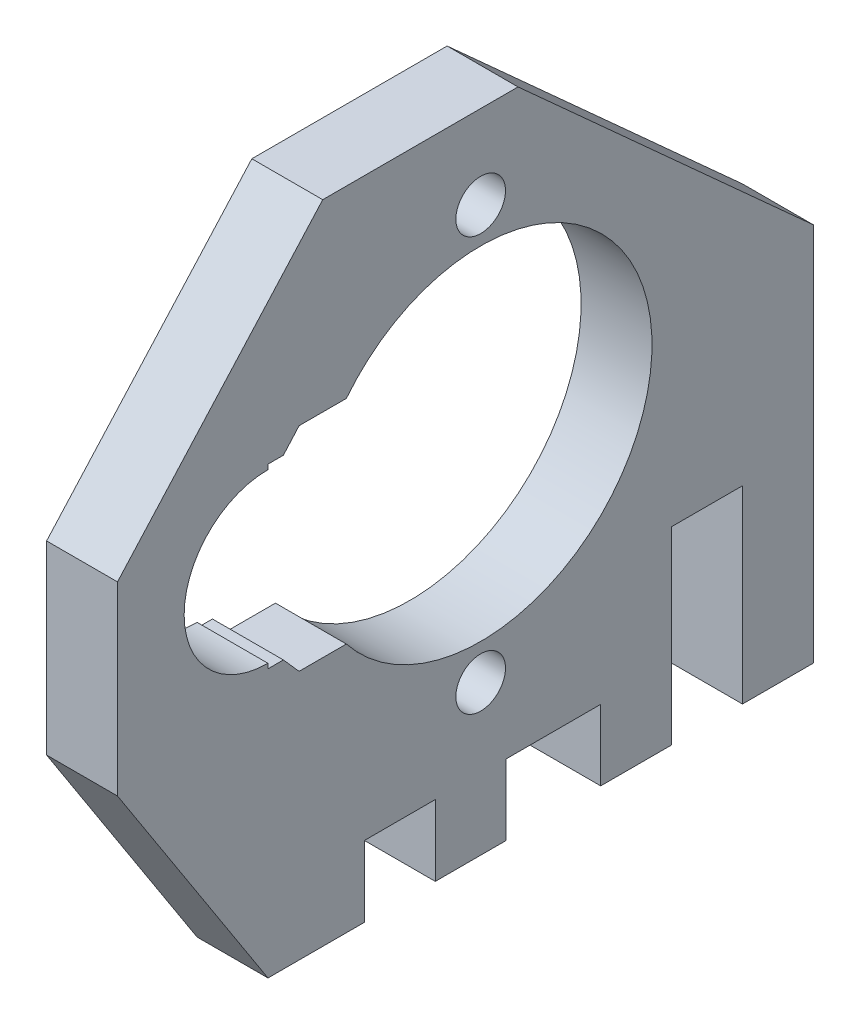
ISO-10303-21;
HEADER;
FILE_DESCRIPTION(('STEP AP214'),'2;1');
FILE_NAME('part.step','',(''),(''),'','','');
FILE_SCHEMA(('AUTOMOTIVE_DESIGN { 1 0 10303 214 1 1 1 1 }'));
ENDSEC;
DATA;
#1=APPLICATION_CONTEXT('core data for automotive mechanical design processes');
#2=APPLICATION_PROTOCOL_DEFINITION('international standard','automotive_design',2000,#1);
#3=PRODUCT_CONTEXT('',#1,'mechanical');
#4=PRODUCT('Part','Part','',(#3));
#5=PRODUCT_RELATED_PRODUCT_CATEGORY('part','',(#4));
#6=PRODUCT_DEFINITION_FORMATION('','',#4);
#7=PRODUCT_DEFINITION_CONTEXT('part definition',#1,'design');
#8=PRODUCT_DEFINITION('design','',#6,#7);
#9=PRODUCT_DEFINITION_SHAPE('','',#8);
#10=(LENGTH_UNIT() NAMED_UNIT(*) SI_UNIT(.MILLI.,.METRE.));
#11=(NAMED_UNIT(*) PLANE_ANGLE_UNIT() SI_UNIT($,.RADIAN.));
#12=(NAMED_UNIT(*) SI_UNIT($,.STERADIAN.) SOLID_ANGLE_UNIT());
#13=UNCERTAINTY_MEASURE_WITH_UNIT(LENGTH_MEASURE(1.E-05),#10,'distance_accuracy_value','');
#14=(GEOMETRIC_REPRESENTATION_CONTEXT(3) GLOBAL_UNCERTAINTY_ASSIGNED_CONTEXT((#13)) GLOBAL_UNIT_ASSIGNED_CONTEXT((#10,
#11,#12)) REPRESENTATION_CONTEXT('',''));
#15=CARTESIAN_POINT('',(0.,0.,0.));
#16=DIRECTION('',(0.,0.,1.));
#17=DIRECTION('',(1.,0.,0.));
#18=AXIS2_PLACEMENT_3D('',#15,#16,#17);
#19=CARTESIAN_POINT('',(6.,0.,10.880328258721));
#20=DIRECTION('',(0.,0.,1.));
#21=DIRECTION('',(1.,0.,0.));
#22=AXIS2_PLACEMENT_3D('',#19,#20,#21);
#23=PLANE('',#22);
#24=DIRECTION('',(0.,1.,0.));
#25=VECTOR('',#24,1.);
#26=CARTESIAN_POINT('',(0.,0.,10.880328258721));
#27=LINE('',#26,#25);
#28=CARTESIAN_POINT('',(0.,-3.40046791418709,10.880328258721));
#29=VERTEX_POINT('',#28);
#30=CARTESIAN_POINT('',(0.,12.2943697080103,10.880328258721));
#31=VERTEX_POINT('',#30);
#32=EDGE_CURVE('E295',#29,#31,#27,.T.);
#33=ORIENTED_EDGE('',*,*,#32,.F.);
#34=DIRECTION('',(-1.,0.,0.));
#35=VECTOR('',#34,1.);
#36=CARTESIAN_POINT('',(6.,-3.40046791418709,10.880328258721));
#37=LINE('',#36,#35);
#38=CARTESIAN_POINT('',(6.,-3.40046791418709,10.880328258721));
#39=VERTEX_POINT('',#38);
#40=EDGE_CURVE('E11',#39,#29,#37,.T.);
#41=ORIENTED_EDGE('',*,*,#40,.F.);
#42=DIRECTION('',(0.,1.,0.));
#43=VECTOR('',#42,1.);
#44=CARTESIAN_POINT('',(6.,0.,10.880328258721));
#45=LINE('',#44,#43);
#46=CARTESIAN_POINT('',(6.,12.2943697080103,10.880328258721));
#47=VERTEX_POINT('',#46);
#48=EDGE_CURVE('E449',#39,#47,#45,.T.);
#49=ORIENTED_EDGE('',*,*,#48,.T.);
#50=DIRECTION('',(-1.,0.,0.));
#51=VECTOR('',#50,1.);
#52=CARTESIAN_POINT('',(6.,12.2943697080103,10.880328258721));
#53=LINE('',#52,#51);
#54=EDGE_CURVE('E54',#47,#31,#53,.T.);
#55=ORIENTED_EDGE('',*,*,#54,.T.);
#56=EDGE_LOOP('',(#33,#41,#49,#55));
#57=FACE_BOUND('',#56,.T.);
#58=ADVANCED_FACE('F35',(#57),#23,.T.);
#59=CARTESIAN_POINT('',(6.,-5.96182546941162,9.22500481892369));
#60=DIRECTION('',(0.,0.542783023363662,-0.839872960362579));
#61=DIRECTION('',(0.,0.839872960362579,0.542783023363662));
#62=AXIS2_PLACEMENT_3D('',#59,#60,#61);
#63=PLANE('',#62);
#64=DIRECTION('',(0.,-0.839872960362579,-0.542783023363662));
#65=VECTOR('',#64,1.);
#66=CARTESIAN_POINT('',(0.,-5.96182546941162,9.22500481892369));
#67=LINE('',#66,#65);
#68=CARTESIAN_POINT('',(0.,-23.1081672603077,-1.8561273));
#69=VERTEX_POINT('',#68);
#70=EDGE_CURVE('E297',#29,#69,#67,.T.);
#71=ORIENTED_EDGE('',*,*,#70,.T.);
#72=DIRECTION('',(-1.,0.,0.));
#73=VECTOR('',#72,1.);
#74=CARTESIAN_POINT('',(6.,-23.1081672603077,-1.8561273));
#75=LINE('',#74,#73);
#76=CARTESIAN_POINT('',(6.,-23.1081672603077,-1.8561273));
#77=VERTEX_POINT('',#76);
#78=EDGE_CURVE('E45',#77,#69,#75,.T.);
#79=ORIENTED_EDGE('',*,*,#78,.F.);
#80=DIRECTION('',(0.,-0.839872960362579,-0.542783023363662));
#81=VECTOR('',#80,1.);
#82=CARTESIAN_POINT('',(6.,-5.96182546941162,9.22500481892369));
#83=LINE('',#82,#81);
#84=EDGE_CURVE('E451',#39,#77,#83,.T.);
#85=ORIENTED_EDGE('',*,*,#84,.F.);
#86=ORIENTED_EDGE('',*,*,#40,.T.);
#87=EDGE_LOOP('',(#71,#79,#85,#86));
#88=FACE_BOUND('',#87,.T.);
#89=ADVANCED_FACE('F511',(#88),#63,.F.);
#90=CARTESIAN_POINT('',(6.,-23.1081672603077,0.));
#91=DIRECTION('',(0.,-1.,0.));
#92=DIRECTION('',(0.,0.,-1.));
#93=AXIS2_PLACEMENT_3D('',#90,#91,#92);
#94=PLANE('',#93);
#95=DIRECTION('',(0.,0.,1.));
#96=VECTOR('',#95,1.);
#97=CARTESIAN_POINT('',(0.,-23.1081672603077,0.));
#98=LINE('',#97,#96);
#99=CARTESIAN_POINT('',(0.,-23.1081672603077,-10.0143952873965));
#100=VERTEX_POINT('',#99);
#101=EDGE_CURVE('E300',#100,#69,#98,.T.);
#102=ORIENTED_EDGE('',*,*,#101,.F.);
#103=DIRECTION('',(-1.,0.,0.));
#104=VECTOR('',#103,1.);
#105=CARTESIAN_POINT('',(6.,-23.1081672603077,-10.0143952873965));
#106=LINE('',#105,#104);
#107=CARTESIAN_POINT('',(6.,-23.1081672603077,-10.0143952873965));
#108=VERTEX_POINT('',#107);
#109=EDGE_CURVE('E378',#108,#100,#106,.T.);
#110=ORIENTED_EDGE('',*,*,#109,.F.);
#111=DIRECTION('',(0.,0.,1.));
#112=VECTOR('',#111,1.);
#113=CARTESIAN_POINT('',(6.,-23.1081672603077,0.));
#114=LINE('',#113,#112);
#115=EDGE_CURVE('E453',#108,#77,#114,.T.);
#116=ORIENTED_EDGE('',*,*,#115,.T.);
#117=ORIENTED_EDGE('',*,*,#78,.T.);
#118=EDGE_LOOP('',(#102,#110,#116,#117));
#119=FACE_BOUND('',#118,.T.);
#120=ADVANCED_FACE('F516',(#119),#94,.T.);
#121=CARTESIAN_POINT('',(6.,0.,-10.0143952873965));
#122=DIRECTION('',(0.,0.,-1.));
#123=DIRECTION('',(-1.,0.,0.));
#124=AXIS2_PLACEMENT_3D('',#121,#122,#123);
#125=PLANE('',#124);
#126=DIRECTION('',(0.,-1.,0.));
#127=VECTOR('',#126,1.);
#128=CARTESIAN_POINT('',(0.,0.,-10.0143952873965));
#129=LINE('',#128,#127);
#130=CARTESIAN_POINT('',(0.,-17.1081672603077,-10.0143952873965));
#131=VERTEX_POINT('',#130);
#132=EDGE_CURVE('E303',#131,#100,#129,.T.);
#133=ORIENTED_EDGE('',*,*,#132,.F.);
#134=DIRECTION('',(-1.,0.,0.));
#135=VECTOR('',#134,1.);
#136=CARTESIAN_POINT('',(6.,-17.1081672603077,-10.0143952873965));
#137=LINE('',#136,#135);
#138=CARTESIAN_POINT('',(6.,-17.1081672603077,-10.0143952873965));
#139=VERTEX_POINT('',#138);
#140=EDGE_CURVE('E376',#139,#131,#137,.T.);
#141=ORIENTED_EDGE('',*,*,#140,.F.);
#142=DIRECTION('',(0.,-1.,0.));
#143=VECTOR('',#142,1.);
#144=CARTESIAN_POINT('',(6.,0.,-10.0143952873965));
#145=LINE('',#144,#143);
#146=EDGE_CURVE('E456',#139,#108,#145,.T.);
#147=ORIENTED_EDGE('',*,*,#146,.T.);
#148=ORIENTED_EDGE('',*,*,#109,.T.);
#149=EDGE_LOOP('',(#133,#141,#147,#148));
#150=FACE_BOUND('',#149,.T.);
#151=ADVANCED_FACE('F608',(#150),#125,.T.);
#152=CARTESIAN_POINT('',(6.,-17.1081672603077,0.));
#153=DIRECTION('',(0.,-1.,0.));
#154=DIRECTION('',(0.,0.,-1.));
#155=AXIS2_PLACEMENT_3D('',#152,#153,#154);
#156=PLANE('',#155);
#157=DIRECTION('',(0.,0.,1.));
#158=VECTOR('',#157,1.);
#159=CARTESIAN_POINT('',(0.,-17.1081672603077,0.));
#160=LINE('',#159,#158);
#161=CARTESIAN_POINT('',(0.,-17.1081672603077,-16.0143952873965));
#162=VERTEX_POINT('',#161);
#163=EDGE_CURVE('E306',#162,#131,#160,.T.);
#164=ORIENTED_EDGE('',*,*,#163,.F.);
#165=DIRECTION('',(-1.,0.,0.));
#166=VECTOR('',#165,1.);
#167=CARTESIAN_POINT('',(6.,-17.1081672603077,-16.0143952873965));
#168=LINE('',#167,#166);
#169=CARTESIAN_POINT('',(6.,-17.1081672603077,-16.0143952873965));
#170=VERTEX_POINT('',#169);
#171=EDGE_CURVE('E374',#170,#162,#168,.T.);
#172=ORIENTED_EDGE('',*,*,#171,.F.);
#173=DIRECTION('',(0.,0.,1.));
#174=VECTOR('',#173,1.);
#175=CARTESIAN_POINT('',(6.,-17.1081672603077,0.));
#176=LINE('',#175,#174);
#177=EDGE_CURVE('E459',#170,#139,#176,.T.);
#178=ORIENTED_EDGE('',*,*,#177,.T.);
#179=ORIENTED_EDGE('',*,*,#140,.T.);
#180=EDGE_LOOP('',(#164,#172,#178,#179));
#181=FACE_BOUND('',#180,.T.);
#182=ADVANCED_FACE('F604',(#181),#156,.T.);
#183=CARTESIAN_POINT('',(6.,0.,-16.0143952873965));
#184=DIRECTION('',(0.,0.,1.));
#185=DIRECTION('',(1.,0.,0.));
#186=AXIS2_PLACEMENT_3D('',#183,#184,#185);
#187=PLANE('',#186);
#188=DIRECTION('',(0.,1.,0.));
#189=VECTOR('',#188,1.);
#190=CARTESIAN_POINT('',(0.,0.,-16.0143952873965));
#191=LINE('',#190,#189);
#192=CARTESIAN_POINT('',(0.,-23.1081672603077,-16.0143952873965));
#193=VERTEX_POINT('',#192);
#194=EDGE_CURVE('E309',#193,#162,#191,.T.);
#195=ORIENTED_EDGE('',*,*,#194,.F.);
#196=DIRECTION('',(-1.,0.,0.));
#197=VECTOR('',#196,1.);
#198=CARTESIAN_POINT('',(6.,-23.1081672603077,-16.0143952873965));
#199=LINE('',#198,#197);
#200=CARTESIAN_POINT('',(6.,-23.1081672603077,-16.0143952873965));
#201=VERTEX_POINT('',#200);
#202=EDGE_CURVE('E372',#201,#193,#199,.T.);
#203=ORIENTED_EDGE('',*,*,#202,.F.);
#204=DIRECTION('',(0.,1.,0.));
#205=VECTOR('',#204,1.);
#206=CARTESIAN_POINT('',(6.,0.,-16.0143952873965));
#207=LINE('',#206,#205);
#208=EDGE_CURVE('E462',#201,#170,#207,.T.);
#209=ORIENTED_EDGE('',*,*,#208,.T.);
#210=ORIENTED_EDGE('',*,*,#171,.T.);
#211=EDGE_LOOP('',(#195,#203,#209,#210));
#212=FACE_BOUND('',#211,.T.);
#213=ADVANCED_FACE('F600',(#212),#187,.T.);
#214=CARTESIAN_POINT('',(6.,-23.1081672603077,0.));
#215=DIRECTION('',(0.,-1.,0.));
#216=DIRECTION('',(0.,0.,-1.));
#217=AXIS2_PLACEMENT_3D('',#214,#215,#216);
#218=PLANE('',#217);
#219=DIRECTION('',(0.,0.,1.));
#220=VECTOR('',#219,1.);
#221=CARTESIAN_POINT('',(0.,-23.1081672603077,0.));
#222=LINE('',#221,#220);
#223=CARTESIAN_POINT('',(0.,-23.1081672603077,-22.0143952873965));
#224=VERTEX_POINT('',#223);
#225=EDGE_CURVE('E312',#224,#193,#222,.T.);
#226=ORIENTED_EDGE('',*,*,#225,.F.);
#227=DIRECTION('',(-1.,0.,0.));
#228=VECTOR('',#227,1.);
#229=CARTESIAN_POINT('',(6.,-23.1081672603077,-22.0143952873965));
#230=LINE('',#229,#228);
#231=CARTESIAN_POINT('',(6.,-23.1081672603077,-22.0143952873965));
#232=VERTEX_POINT('',#231);
#233=EDGE_CURVE('E370',#232,#224,#230,.T.);
#234=ORIENTED_EDGE('',*,*,#233,.F.);
#235=DIRECTION('',(0.,0.,1.));
#236=VECTOR('',#235,1.);
#237=CARTESIAN_POINT('',(6.,-23.1081672603077,0.));
#238=LINE('',#237,#236);
#239=EDGE_CURVE('E465',#232,#201,#238,.T.);
#240=ORIENTED_EDGE('',*,*,#239,.T.);
#241=ORIENTED_EDGE('',*,*,#202,.T.);
#242=EDGE_LOOP('',(#226,#234,#240,#241));
#243=FACE_BOUND('',#242,.T.);
#244=ADVANCED_FACE('F596',(#243),#218,.T.);
#245=CARTESIAN_POINT('',(6.,0.,-22.0143952873965));
#246=DIRECTION('',(0.,0.,-1.));
#247=DIRECTION('',(-1.,0.,0.));
#248=AXIS2_PLACEMENT_3D('',#245,#246,#247);
#249=PLANE('',#248);
#250=DIRECTION('',(0.,-1.,0.));
#251=VECTOR('',#250,1.);
#252=CARTESIAN_POINT('',(0.,0.,-22.0143952873965));
#253=LINE('',#252,#251);
#254=CARTESIAN_POINT('',(0.,-17.1284099513648,-22.0143952873965));
#255=VERTEX_POINT('',#254);
#256=EDGE_CURVE('E315',#255,#224,#253,.T.);
#257=ORIENTED_EDGE('',*,*,#256,.F.);
#258=DIRECTION('',(-1.,0.,0.));
#259=VECTOR('',#258,1.);
#260=CARTESIAN_POINT('',(6.,-17.1284099513648,-22.0143952873965));
#261=LINE('',#260,#259);
#262=CARTESIAN_POINT('',(6.,-17.1284099513648,-22.0143952873965));
#263=VERTEX_POINT('',#262);
#264=EDGE_CURVE('E368',#263,#255,#261,.T.);
#265=ORIENTED_EDGE('',*,*,#264,.F.);
#266=DIRECTION('',(0.,-1.,0.));
#267=VECTOR('',#266,1.);
#268=CARTESIAN_POINT('',(6.,0.,-22.0143952873965));
#269=LINE('',#268,#267);
#270=EDGE_CURVE('E468',#263,#232,#269,.T.);
#271=ORIENTED_EDGE('',*,*,#270,.T.);
#272=ORIENTED_EDGE('',*,*,#233,.T.);
#273=EDGE_LOOP('',(#257,#265,#271,#272));
#274=FACE_BOUND('',#273,.T.);
#275=ADVANCED_FACE('F592',(#274),#249,.T.);
#276=CARTESIAN_POINT('',(6.,-17.1284099513648,0.));
#277=DIRECTION('',(0.,-1.,0.));
#278=DIRECTION('',(0.,0.,-1.));
#279=AXIS2_PLACEMENT_3D('',#276,#277,#278);
#280=PLANE('',#279);
#281=DIRECTION('',(0.,0.,1.));
#282=VECTOR('',#281,1.);
#283=CARTESIAN_POINT('',(0.,-17.1284099513648,0.));
#284=LINE('',#283,#282);
#285=CARTESIAN_POINT('',(0.,-17.1284099513648,-30.0143952873965));
#286=VERTEX_POINT('',#285);
#287=EDGE_CURVE('E318',#286,#255,#284,.T.);
#288=ORIENTED_EDGE('',*,*,#287,.F.);
#289=DIRECTION('',(-1.,0.,0.));
#290=VECTOR('',#289,1.);
#291=CARTESIAN_POINT('',(6.,-17.1284099513648,-30.0143952873965));
#292=LINE('',#291,#290);
#293=CARTESIAN_POINT('',(6.,-17.1284099513648,-30.0143952873965));
#294=VERTEX_POINT('',#293);
#295=EDGE_CURVE('E366',#294,#286,#292,.T.);
#296=ORIENTED_EDGE('',*,*,#295,.F.);
#297=DIRECTION('',(0.,0.,1.));
#298=VECTOR('',#297,1.);
#299=CARTESIAN_POINT('',(6.,-17.1284099513648,0.));
#300=LINE('',#299,#298);
#301=EDGE_CURVE('E471',#294,#263,#300,.T.);
#302=ORIENTED_EDGE('',*,*,#301,.T.);
#303=ORIENTED_EDGE('',*,*,#264,.T.);
#304=EDGE_LOOP('',(#288,#296,#302,#303));
#305=FACE_BOUND('',#304,.T.);
#306=ADVANCED_FACE('F588',(#305),#280,.T.);
#307=CARTESIAN_POINT('',(6.,0.,-30.0143952873965));
#308=DIRECTION('',(0.,0.,1.));
#309=DIRECTION('',(1.,0.,0.));
#310=AXIS2_PLACEMENT_3D('',#307,#308,#309);
#311=PLANE('',#310);
#312=DIRECTION('',(0.,1.,0.));
#313=VECTOR('',#312,1.);
#314=CARTESIAN_POINT('',(0.,0.,-30.0143952873965));
#315=LINE('',#314,#313);
#316=CARTESIAN_POINT('',(0.,-23.1081672603077,-30.0143952873965));
#317=VERTEX_POINT('',#316);
#318=EDGE_CURVE('E321',#317,#286,#315,.T.);
#319=ORIENTED_EDGE('',*,*,#318,.F.);
#320=DIRECTION('',(-1.,0.,0.));
#321=VECTOR('',#320,1.);
#322=CARTESIAN_POINT('',(6.,-23.1081672603077,-30.0143952873965));
#323=LINE('',#322,#321);
#324=CARTESIAN_POINT('',(6.,-23.1081672603077,-30.0143952873965));
#325=VERTEX_POINT('',#324);
#326=EDGE_CURVE('E364',#325,#317,#323,.T.);
#327=ORIENTED_EDGE('',*,*,#326,.F.);
#328=DIRECTION('',(0.,1.,0.));
#329=VECTOR('',#328,1.);
#330=CARTESIAN_POINT('',(6.,0.,-30.0143952873965));
#331=LINE('',#330,#329);
#332=EDGE_CURVE('E474',#325,#294,#331,.T.);
#333=ORIENTED_EDGE('',*,*,#332,.T.);
#334=ORIENTED_EDGE('',*,*,#295,.T.);
#335=EDGE_LOOP('',(#319,#327,#333,#334));
#336=FACE_BOUND('',#335,.T.);
#337=ADVANCED_FACE('F584',(#336),#311,.T.);
#338=CARTESIAN_POINT('',(6.,-23.1081672603077,0.));
#339=DIRECTION('',(0.,-1.,0.));
#340=DIRECTION('',(0.,0.,-1.));
#341=AXIS2_PLACEMENT_3D('',#338,#339,#340);
#342=PLANE('',#341);
#343=DIRECTION('',(0.,0.,1.));
#344=VECTOR('',#343,1.);
#345=CARTESIAN_POINT('',(0.,-23.1081672603077,0.));
#346=LINE('',#345,#344);
#347=CARTESIAN_POINT('',(0.,-23.1081672603077,-36.0143952873965));
#348=VERTEX_POINT('',#347);
#349=EDGE_CURVE('E324',#348,#317,#346,.T.);
#350=ORIENTED_EDGE('',*,*,#349,.F.);
#351=DIRECTION('',(-1.,0.,0.));
#352=VECTOR('',#351,1.);
#353=CARTESIAN_POINT('',(6.,-23.1081672603077,-36.0143952873965));
#354=LINE('',#353,#352);
#355=CARTESIAN_POINT('',(6.,-23.1081672603077,-36.0143952873965));
#356=VERTEX_POINT('',#355);
#357=EDGE_CURVE('E362',#356,#348,#354,.T.);
#358=ORIENTED_EDGE('',*,*,#357,.F.);
#359=DIRECTION('',(0.,0.,1.));
#360=VECTOR('',#359,1.);
#361=CARTESIAN_POINT('',(6.,-23.1081672603077,0.));
#362=LINE('',#361,#360);
#363=EDGE_CURVE('E477',#356,#325,#362,.T.);
#364=ORIENTED_EDGE('',*,*,#363,.T.);
#365=ORIENTED_EDGE('',*,*,#326,.T.);
#366=EDGE_LOOP('',(#350,#358,#364,#365));
#367=FACE_BOUND('',#366,.T.);
#368=ADVANCED_FACE('F580',(#367),#342,.T.);
#369=CARTESIAN_POINT('',(6.,0.,-36.0143952873965));
#370=DIRECTION('',(0.,0.,1.));
#371=DIRECTION('',(1.,0.,0.));
#372=AXIS2_PLACEMENT_3D('',#369,#370,#371);
#373=PLANE('',#372);
#374=DIRECTION('',(0.,1.,0.));
#375=VECTOR('',#374,1.);
#376=CARTESIAN_POINT('',(0.,0.,-36.0143952873965));
#377=LINE('',#376,#375);
#378=CARTESIAN_POINT('',(0.,-7.10816726030771,-36.0143952873965));
#379=VERTEX_POINT('',#378);
#380=EDGE_CURVE('E327',#348,#379,#377,.T.);
#381=ORIENTED_EDGE('',*,*,#380,.T.);
#382=DIRECTION('',(-1.,0.,0.));
#383=VECTOR('',#382,1.);
#384=CARTESIAN_POINT('',(6.,-7.10816726030771,-36.0143952873965));
#385=LINE('',#384,#383);
#386=CARTESIAN_POINT('',(6.,-7.10816726030771,-36.0143952873965));
#387=VERTEX_POINT('',#386);
#388=EDGE_CURVE('E359',#387,#379,#385,.T.);
#389=ORIENTED_EDGE('',*,*,#388,.F.);
#390=DIRECTION('',(0.,1.,0.));
#391=VECTOR('',#390,1.);
#392=CARTESIAN_POINT('',(6.,0.,-36.0143952873965));
#393=LINE('',#392,#391);
#394=EDGE_CURVE('E480',#356,#387,#393,.T.);
#395=ORIENTED_EDGE('',*,*,#394,.F.);
#396=ORIENTED_EDGE('',*,*,#357,.T.);
#397=EDGE_LOOP('',(#381,#389,#395,#396));
#398=FACE_BOUND('',#397,.T.);
#399=ADVANCED_FACE('F576',(#398),#373,.F.);
#400=CARTESIAN_POINT('',(6.,-7.10816726030771,0.));
#401=DIRECTION('',(0.,1.,0.));
#402=DIRECTION('',(0.,0.,1.));
#403=AXIS2_PLACEMENT_3D('',#400,#401,#402);
#404=PLANE('',#403);
#405=DIRECTION('',(0.,0.,-1.));
#406=VECTOR('',#405,1.);
#407=CARTESIAN_POINT('',(0.,-7.10816726030771,0.));
#408=LINE('',#407,#406);
#409=CARTESIAN_POINT('',(0.,-7.10816726030771,-42.0143952873964));
#410=VERTEX_POINT('',#409);
#411=EDGE_CURVE('E330',#379,#410,#408,.T.);
#412=ORIENTED_EDGE('',*,*,#411,.T.);
#413=DIRECTION('',(-1.,0.,0.));
#414=VECTOR('',#413,1.);
#415=CARTESIAN_POINT('',(6.,-7.10816726030771,-42.0143952873964));
#416=LINE('',#415,#414);
#417=CARTESIAN_POINT('',(6.,-7.10816726030771,-42.0143952873964));
#418=VERTEX_POINT('',#417);
#419=EDGE_CURVE('E356',#418,#410,#416,.T.);
#420=ORIENTED_EDGE('',*,*,#419,.F.);
#421=DIRECTION('',(0.,0.,-1.));
#422=VECTOR('',#421,1.);
#423=CARTESIAN_POINT('',(6.,-7.10816726030771,0.));
#424=LINE('',#423,#422);
#425=EDGE_CURVE('E483',#387,#418,#424,.T.);
#426=ORIENTED_EDGE('',*,*,#425,.F.);
#427=ORIENTED_EDGE('',*,*,#388,.T.);
#428=EDGE_LOOP('',(#412,#420,#426,#427));
#429=FACE_BOUND('',#428,.T.);
#430=ADVANCED_FACE('F572',(#429),#404,.F.);
#431=CARTESIAN_POINT('',(6.,0.,-42.0143952873964));
#432=DIRECTION('',(0.,0.,-1.));
#433=DIRECTION('',(-1.,0.,0.));
#434=AXIS2_PLACEMENT_3D('',#431,#432,#433);
#435=PLANE('',#434);
#436=DIRECTION('',(0.,-1.,0.));
#437=VECTOR('',#436,1.);
#438=CARTESIAN_POINT('',(0.,0.,-42.0143952873964));
#439=LINE('',#438,#437);
#440=CARTESIAN_POINT('',(0.,-23.1081672603077,-42.0143952873964));
#441=VERTEX_POINT('',#440);
#442=EDGE_CURVE('E333',#410,#441,#439,.T.);
#443=ORIENTED_EDGE('',*,*,#442,.T.);
#444=DIRECTION('',(-1.,0.,0.));
#445=VECTOR('',#444,1.);
#446=CARTESIAN_POINT('',(6.,-23.1081672603077,-42.0143952873964));
#447=LINE('',#446,#445);
#448=CARTESIAN_POINT('',(6.,-23.1081672603077,-42.0143952873964));
#449=VERTEX_POINT('',#448);
#450=EDGE_CURVE('E354',#449,#441,#447,.T.);
#451=ORIENTED_EDGE('',*,*,#450,.F.);
#452=DIRECTION('',(0.,-1.,0.));
#453=VECTOR('',#452,1.);
#454=CARTESIAN_POINT('',(6.,0.,-42.0143952873964));
#455=LINE('',#454,#453);
#456=EDGE_CURVE('E486',#418,#449,#455,.T.);
#457=ORIENTED_EDGE('',*,*,#456,.F.);
#458=ORIENTED_EDGE('',*,*,#419,.T.);
#459=EDGE_LOOP('',(#443,#451,#457,#458));
#460=FACE_BOUND('',#459,.T.);
#461=ADVANCED_FACE('F568',(#460),#435,.F.);
#462=CARTESIAN_POINT('',(6.,-23.1081672603077,0.));
#463=DIRECTION('',(0.,-1.,0.));
#464=DIRECTION('',(0.,0.,-1.));
#465=AXIS2_PLACEMENT_3D('',#462,#463,#464);
#466=PLANE('',#465);
#467=DIRECTION('',(0.,0.,1.));
#468=VECTOR('',#467,1.);
#469=CARTESIAN_POINT('',(0.,-23.1081672603077,0.));
#470=LINE('',#469,#468);
#471=CARTESIAN_POINT('',(0.,-23.1081672603077,-48.0143952873964));
#472=VERTEX_POINT('',#471);
#473=EDGE_CURVE('E336',#472,#441,#470,.T.);
#474=ORIENTED_EDGE('',*,*,#473,.F.);
#475=DIRECTION('',(-1.,0.,0.));
#476=VECTOR('',#475,1.);
#477=CARTESIAN_POINT('',(6.,-23.1081672603077,-48.0143952873964));
#478=LINE('',#477,#476);
#479=CARTESIAN_POINT('',(6.,-23.1081672603077,-48.0143952873964));
#480=VERTEX_POINT('',#479);
#481=EDGE_CURVE('E352',#480,#472,#478,.T.);
#482=ORIENTED_EDGE('',*,*,#481,.F.);
#483=DIRECTION('',(0.,0.,1.));
#484=VECTOR('',#483,1.);
#485=CARTESIAN_POINT('',(6.,-23.1081672603077,0.));
#486=LINE('',#485,#484);
#487=EDGE_CURVE('E488',#480,#449,#486,.T.);
#488=ORIENTED_EDGE('',*,*,#487,.T.);
#489=ORIENTED_EDGE('',*,*,#450,.T.);
#490=EDGE_LOOP('',(#474,#482,#488,#489));
#491=FACE_BOUND('',#490,.T.);
#492=ADVANCED_FACE('F565',(#491),#466,.T.);
#493=CARTESIAN_POINT('',(6.,0.,-48.0143952873964));
#494=DIRECTION('',(0.,0.,-1.));
#495=DIRECTION('',(-1.,0.,0.));
#496=AXIS2_PLACEMENT_3D('',#493,#494,#495);
#497=PLANE('',#496);
#498=DIRECTION('',(0.,-1.,0.));
#499=VECTOR('',#498,1.);
#500=CARTESIAN_POINT('',(0.,0.,-48.0143952873964));
#501=LINE('',#500,#499);
#502=CARTESIAN_POINT('',(0.,9.01762803628445,-48.0143952873965));
#503=VERTEX_POINT('',#502);
#504=EDGE_CURVE('E339',#503,#472,#501,.T.);
#505=ORIENTED_EDGE('',*,*,#504,.F.);
#506=DIRECTION('',(-1.,0.,0.));
#507=VECTOR('',#506,1.);
#508=CARTESIAN_POINT('',(6.,9.01762803628445,-48.0143952873965));
#509=LINE('',#508,#507);
#510=CARTESIAN_POINT('',(6.,9.01762803628445,-48.0143952873965));
#511=VERTEX_POINT('',#510);
#512=EDGE_CURVE('E242',#511,#503,#509,.T.);
#513=ORIENTED_EDGE('',*,*,#512,.F.);
#514=DIRECTION('',(0.,-1.,0.));
#515=VECTOR('',#514,1.);
#516=CARTESIAN_POINT('',(6.,0.,-48.0143952873964));
#517=LINE('',#516,#515);
#518=EDGE_CURVE('E253',#511,#480,#517,.T.);
#519=ORIENTED_EDGE('',*,*,#518,.T.);
#520=ORIENTED_EDGE('',*,*,#481,.T.);
#521=EDGE_LOOP('',(#505,#513,#519,#520));
#522=FACE_BOUND('',#521,.T.);
#523=ADVANCED_FACE('F492',(#522),#497,.T.);
#524=CARTESIAN_POINT('',(6.,28.847177777319,-26.0854161307142));
#525=DIRECTION('',(0.,0.74172010016957,-0.670709544441141));
#526=DIRECTION('',(0.,0.670709544441141,0.74172010016957));
#527=AXIS2_PLACEMENT_3D('',#524,#525,#526);
#528=PLANE('',#527);
#529=DIRECTION('',(0.,-0.670709544441141,-0.74172010016957));
#530=VECTOR('',#529,1.);
#531=CARTESIAN_POINT('',(0.,28.847177777319,-26.0854161307142));
#532=LINE('',#531,#530);
#533=CARTESIAN_POINT('',(0.,31.6218644859276,-23.0169628479102));
#534=VERTEX_POINT('',#533);
#535=EDGE_CURVE('E238',#534,#503,#532,.T.);
#536=ORIENTED_EDGE('',*,*,#535,.F.);
#537=DIRECTION('',(-1.,0.,0.));
#538=VECTOR('',#537,1.);
#539=CARTESIAN_POINT('',(6.,31.6218644859276,-23.0169628479102));
#540=LINE('',#539,#538);
#541=CARTESIAN_POINT('',(6.,31.6218644859276,-23.0169628479102));
#542=VERTEX_POINT('',#541);
#543=EDGE_CURVE('E233',#542,#534,#540,.T.);
#544=ORIENTED_EDGE('',*,*,#543,.F.);
#545=DIRECTION('',(0.,-0.670709544441141,-0.74172010016957));
#546=VECTOR('',#545,1.);
#547=CARTESIAN_POINT('',(6.,28.847177777319,-26.0854161307142));
#548=LINE('',#547,#546);
#549=EDGE_CURVE('E236',#542,#511,#548,.T.);
#550=ORIENTED_EDGE('',*,*,#549,.T.);
#551=ORIENTED_EDGE('',*,*,#512,.T.);
#552=EDGE_LOOP('',(#536,#544,#550,#551));
#553=FACE_BOUND('',#552,.T.);
#554=ADVANCED_FACE('F235',(#553),#528,.T.);
#555=CARTESIAN_POINT('',(6.,31.6218644859276,0.));
#556=DIRECTION('',(0.,1.,0.));
#557=DIRECTION('',(0.,0.,1.));
#558=AXIS2_PLACEMENT_3D('',#555,#556,#557);
#559=PLANE('',#558);
#560=DIRECTION('',(0.,0.,-1.));
#561=VECTOR('',#560,1.);
#562=CARTESIAN_POINT('',(0.,31.6218644859276,0.));
#563=LINE('',#562,#561);
#564=CARTESIAN_POINT('',(0.,31.6218644859276,-6.48845155203242));
#565=VERTEX_POINT('',#564);
#566=EDGE_CURVE('E343',#565,#534,#563,.T.);
#567=ORIENTED_EDGE('',*,*,#566,.F.);
#568=DIRECTION('',(-1.,0.,0.));
#569=VECTOR('',#568,1.);
#570=CARTESIAN_POINT('',(6.,31.6218644859276,-6.48845155203242));
#571=LINE('',#570,#569);
#572=CARTESIAN_POINT('',(6.,31.6218644859276,-6.48845155203242));
#573=VERTEX_POINT('',#572);
#574=EDGE_CURVE('E142',#573,#565,#571,.T.);
#575=ORIENTED_EDGE('',*,*,#574,.F.);
#576=DIRECTION('',(0.,0.,-1.));
#577=VECTOR('',#576,1.);
#578=CARTESIAN_POINT('',(6.,31.6218644859276,0.));
#579=LINE('',#578,#577);
#580=EDGE_CURVE('E250',#573,#542,#579,.T.);
#581=ORIENTED_EDGE('',*,*,#580,.T.);
#582=ORIENTED_EDGE('',*,*,#543,.T.);
#583=EDGE_LOOP('',(#567,#575,#581,#582));
#584=FACE_BOUND('',#583,.T.);
#585=ADVANCED_FACE('F255',(#584),#559,.T.);
#586=CARTESIAN_POINT('',(6.,16.0546831132346,0.));
#587=DIRECTION('',(0.,-1.,0.));
#588=DIRECTION('',(0.,0.,-1.));
#589=AXIS2_PLACEMENT_3D('',#586,#587,#588);
#590=PLANE('',#589);
#591=DIRECTION('',(0.,0.,1.));
#592=VECTOR('',#591,1.);
#593=CARTESIAN_POINT('',(0.,16.0546831132346,0.));
#594=LINE('',#593,#592);
#595=CARTESIAN_POINT('',(0.,16.0546831132346,-8.48731029909792));
#596=VERTEX_POINT('',#595);
#597=CARTESIAN_POINT('',(0.,16.0546831132346,-4.48731029909793));
#598=VERTEX_POINT('',#597);
#599=EDGE_CURVE('E262',#596,#598,#594,.T.);
#600=ORIENTED_EDGE('',*,*,#599,.F.);
#601=DIRECTION('',(-1.,0.,0.));
#602=VECTOR('',#601,1.);
#603=CARTESIAN_POINT('',(6.,16.0546831132346,-8.48731029909792));
#604=LINE('',#603,#602);
#605=CARTESIAN_POINT('',(6.,16.0546831132346,-8.48731029909792));
#606=VERTEX_POINT('',#605);
#607=EDGE_CURVE('E39',#606,#596,#604,.T.);
#608=ORIENTED_EDGE('',*,*,#607,.F.);
#609=DIRECTION('',(0.,0.,1.));
#610=VECTOR('',#609,1.);
#611=CARTESIAN_POINT('',(6.,16.0546831132346,0.));
#612=LINE('',#611,#610);
#613=CARTESIAN_POINT('',(6.,16.0546831132346,-4.48731029909793));
#614=VERTEX_POINT('',#613);
#615=EDGE_CURVE('E348',#606,#614,#612,.T.);
#616=ORIENTED_EDGE('',*,*,#615,.T.);
#617=DIRECTION('',(-1.,0.,0.));
#618=VECTOR('',#617,1.);
#619=CARTESIAN_POINT('',(6.,16.0546831132346,-4.48731029909793));
#620=LINE('',#619,#618);
#621=EDGE_CURVE('E258',#614,#598,#620,.T.);
#622=ORIENTED_EDGE('',*,*,#621,.T.);
#623=EDGE_LOOP('',(#600,#608,#616,#622));
#624=FACE_BOUND('',#623,.T.);
#625=ADVANCED_FACE('F37',(#624),#590,.T.);
#626=CARTESIAN_POINT('',(6.,7.05468311323463,-19.8561273));
#627=DIRECTION('',(-1.,0.,0.));
#628=DIRECTION('',(0.,0.,1.));
#629=AXIS2_PLACEMENT_3D('',#626,#627,#628);
#630=CYLINDRICAL_SURFACE('',#629,14.5);
#631=CARTESIAN_POINT('',(0.,7.05468311323463,-19.8561273));
#632=DIRECTION('',(1.,0.,0.));
#633=DIRECTION('',(0.,0.,-1.));
#634=AXIS2_PLACEMENT_3D('',#631,#632,#633);
#635=CIRCLE('',#634,14.5);
#636=CARTESIAN_POINT('',(0.,-1.94531688676536,-8.48731029909792));
#637=VERTEX_POINT('',#636);
#638=EDGE_CURVE('E265',#637,#596,#635,.T.);
#639=ORIENTED_EDGE('',*,*,#638,.F.);
#640=DIRECTION('',(-1.,0.,0.));
#641=VECTOR('',#640,1.);
#642=CARTESIAN_POINT('',(6.,-1.94531688676536,-8.48731029909792));
#643=LINE('',#642,#641);
#644=CARTESIAN_POINT('',(6.,-1.94531688676536,-8.48731029909792));
#645=VERTEX_POINT('',#644);
#646=EDGE_CURVE('E398',#645,#637,#643,.T.);
#647=ORIENTED_EDGE('',*,*,#646,.F.);
#648=CARTESIAN_POINT('',(6.,7.05468311323463,-19.8561273));
#649=DIRECTION('',(1.,0.,0.));
#650=DIRECTION('',(0.,0.,-1.));
#651=AXIS2_PLACEMENT_3D('',#648,#649,#650);
#652=CIRCLE('',#651,14.5);
#653=EDGE_CURVE('E407',#645,#606,#652,.T.);
#654=ORIENTED_EDGE('',*,*,#653,.T.);
#655=ORIENTED_EDGE('',*,*,#607,.T.);
#656=EDGE_LOOP('',(#639,#647,#654,#655));
#657=FACE_BOUND('',#656,.T.);
#658=ADVANCED_FACE('F405',(#657),#630,.F.);
#659=CARTESIAN_POINT('',(6.,-1.94531688676536,0.));
#660=DIRECTION('',(0.,-1.,0.));
#661=DIRECTION('',(0.,0.,-1.));
#662=AXIS2_PLACEMENT_3D('',#659,#660,#661);
#663=PLANE('',#662);
#664=DIRECTION('',(0.,0.,1.));
#665=VECTOR('',#664,1.);
#666=CARTESIAN_POINT('',(0.,-1.94531688676536,0.));
#667=LINE('',#666,#665);
#668=CARTESIAN_POINT('',(0.,-1.94531688676536,-4.48731029909793));
#669=VERTEX_POINT('',#668);
#670=EDGE_CURVE('E268',#637,#669,#667,.T.);
#671=ORIENTED_EDGE('',*,*,#670,.T.);
#672=DIRECTION('',(-1.,0.,0.));
#673=VECTOR('',#672,1.);
#674=CARTESIAN_POINT('',(6.,-1.94531688676536,-4.48731029909793));
#675=LINE('',#674,#673);
#676=CARTESIAN_POINT('',(6.,-1.94531688676536,-4.48731029909793));
#677=VERTEX_POINT('',#676);
#678=EDGE_CURVE('E396',#677,#669,#675,.T.);
#679=ORIENTED_EDGE('',*,*,#678,.F.);
#680=DIRECTION('',(0.,0.,1.));
#681=VECTOR('',#680,1.);
#682=CARTESIAN_POINT('',(6.,-1.94531688676536,0.));
#683=LINE('',#682,#681);
#684=EDGE_CURVE('E424',#645,#677,#683,.T.);
#685=ORIENTED_EDGE('',*,*,#684,.F.);
#686=ORIENTED_EDGE('',*,*,#646,.T.);
#687=EDGE_LOOP('',(#671,#679,#685,#686));
#688=FACE_BOUND('',#687,.T.);
#689=ADVANCED_FACE('F415',(#688),#663,.F.);
#690=CARTESIAN_POINT('',(6.,1.37068261914675,-1.54450885423972));
#691=DIRECTION('',(0.,-0.663764663384609,0.747941489450824));
#692=DIRECTION('',(0.,-0.747941489450824,-0.663764663384609));
#693=AXIS2_PLACEMENT_3D('',#690,#691,#692);
#694=PLANE('',#693);
#695=DIRECTION('',(0.,0.747941489450824,0.663764663384609));
#696=VECTOR('',#695,1.);
#697=CARTESIAN_POINT('',(0.,1.37068261914675,-1.54450885423972));
#698=LINE('',#697,#696);
#699=CARTESIAN_POINT('',(0.,-0.445316886765364,-3.1561273));
#700=VERTEX_POINT('',#699);
#701=EDGE_CURVE('E270',#669,#700,#698,.T.);
#702=ORIENTED_EDGE('',*,*,#701,.T.);
#703=DIRECTION('',(-1.,0.,0.));
#704=VECTOR('',#703,1.);
#705=CARTESIAN_POINT('',(6.,-0.445316886765364,-3.1561273));
#706=LINE('',#705,#704);
#707=CARTESIAN_POINT('',(6.,-0.445316886765364,-3.1561273));
#708=VERTEX_POINT('',#707);
#709=EDGE_CURVE('E393',#708,#700,#706,.T.);
#710=ORIENTED_EDGE('',*,*,#709,.F.);
#711=DIRECTION('',(0.,0.747941489450824,0.663764663384609));
#712=VECTOR('',#711,1.);
#713=CARTESIAN_POINT('',(6.,1.37068261914675,-1.54450885423972));
#714=LINE('',#713,#712);
#715=EDGE_CURVE('E420',#677,#708,#714,.T.);
#716=ORIENTED_EDGE('',*,*,#715,.F.);
#717=ORIENTED_EDGE('',*,*,#678,.T.);
#718=EDGE_LOOP('',(#702,#710,#716,#717));
#719=FACE_BOUND('',#718,.T.);
#720=ADVANCED_FACE('F418',(#719),#694,.F.);
#721=CARTESIAN_POINT('',(6.,-0.445316886765366,0.));
#722=DIRECTION('',(0.,-1.,0.));
#723=DIRECTION('',(0.,0.,-1.));
#724=AXIS2_PLACEMENT_3D('',#721,#722,#723);
#725=PLANE('',#724);
#726=DIRECTION('',(0.,0.,1.));
#727=VECTOR('',#726,1.);
#728=CARTESIAN_POINT('',(0.,-0.445316886765366,0.));
#729=LINE('',#728,#727);
#730=CARTESIAN_POINT('',(0.,-0.445316886765365,-1.8561273));
#731=VERTEX_POINT('',#730);
#732=EDGE_CURVE('E272',#700,#731,#729,.T.);
#733=ORIENTED_EDGE('',*,*,#732,.T.);
#734=DIRECTION('',(-1.,0.,0.));
#735=VECTOR('',#734,1.);
#736=CARTESIAN_POINT('',(6.,-0.445316886765365,-1.8561273));
#737=LINE('',#736,#735);
#738=CARTESIAN_POINT('',(6.,-0.445316886765365,-1.8561273));
#739=VERTEX_POINT('',#738);
#740=EDGE_CURVE('E390',#739,#731,#737,.T.);
#741=ORIENTED_EDGE('',*,*,#740,.F.);
#742=DIRECTION('',(0.,0.,1.));
#743=VECTOR('',#742,1.);
#744=CARTESIAN_POINT('',(6.,-0.445316886765366,0.));
#745=LINE('',#744,#743);
#746=EDGE_CURVE('E423',#708,#739,#745,.T.);
#747=ORIENTED_EDGE('',*,*,#746,.F.);
#748=ORIENTED_EDGE('',*,*,#709,.T.);
#749=EDGE_LOOP('',(#733,#741,#747,#748));
#750=FACE_BOUND('',#749,.T.);
#751=ADVANCED_FACE('F543',(#750),#725,.F.);
#752=CARTESIAN_POINT('',(6.,0.,-1.8561273));
#753=DIRECTION('',(0.,0.,1.));
#754=DIRECTION('',(1.,0.,0.));
#755=AXIS2_PLACEMENT_3D('',#752,#753,#754);
#756=PLANE('',#755);
#757=DIRECTION('',(0.,1.,0.));
#758=VECTOR('',#757,1.);
#759=CARTESIAN_POINT('',(0.,0.,-1.8561273));
#760=LINE('',#759,#758);
#761=CARTESIAN_POINT('',(0.,-0.0417690883419272,-1.8561273));
#762=VERTEX_POINT('',#761);
#763=EDGE_CURVE('E274',#731,#762,#760,.T.);
#764=ORIENTED_EDGE('',*,*,#763,.T.);
#765=DIRECTION('',(-1.,0.,0.));
#766=VECTOR('',#765,1.);
#767=CARTESIAN_POINT('',(6.,-0.0417690883419272,-1.8561273));
#768=LINE('',#767,#766);
#769=CARTESIAN_POINT('',(6.,-0.0417690883419272,-1.8561273));
#770=VERTEX_POINT('',#769);
#771=EDGE_CURVE('E388',#770,#762,#768,.T.);
#772=ORIENTED_EDGE('',*,*,#771,.F.);
#773=DIRECTION('',(0.,1.,0.));
#774=VECTOR('',#773,1.);
#775=CARTESIAN_POINT('',(6.,0.,-1.8561273));
#776=LINE('',#775,#774);
#777=EDGE_CURVE('E426',#739,#770,#776,.T.);
#778=ORIENTED_EDGE('',*,*,#777,.F.);
#779=ORIENTED_EDGE('',*,*,#740,.T.);
#780=EDGE_LOOP('',(#764,#772,#778,#779));
#781=FACE_BOUND('',#780,.T.);
#782=ADVANCED_FACE('F539',(#781),#756,.F.);
#783=CARTESIAN_POINT('',(6.,7.05468311323463,-1.8561273));
#784=DIRECTION('',(-1.,0.,0.));
#785=DIRECTION('',(0.,0.,1.));
#786=AXIS2_PLACEMENT_3D('',#783,#784,#785);
#787=CYLINDRICAL_SURFACE('',#786,7.09645220157656);
#788=CARTESIAN_POINT('',(0.,7.05468311323463,-1.8561273));
#789=DIRECTION('',(1.,0.,0.));
#790=DIRECTION('',(0.,0.,-1.));
#791=AXIS2_PLACEMENT_3D('',#788,#789,#790);
#792=CIRCLE('',#791,7.09645220157656);
#793=CARTESIAN_POINT('',(0.,14.1511353148112,-1.8561273));
#794=VERTEX_POINT('',#793);
#795=EDGE_CURVE('E277',#794,#762,#792,.T.);
#796=ORIENTED_EDGE('',*,*,#795,.F.);
#797=DIRECTION('',(-1.,0.,0.));
#798=VECTOR('',#797,1.);
#799=CARTESIAN_POINT('',(6.,14.1511353148112,-1.8561273));
#800=LINE('',#799,#798);
#801=CARTESIAN_POINT('',(6.,14.1511353148112,-1.8561273));
#802=VERTEX_POINT('',#801);
#803=EDGE_CURVE('E386',#802,#794,#800,.T.);
#804=ORIENTED_EDGE('',*,*,#803,.F.);
#805=CARTESIAN_POINT('',(6.,7.05468311323463,-1.8561273));
#806=DIRECTION('',(1.,0.,0.));
#807=DIRECTION('',(0.,0.,-1.));
#808=AXIS2_PLACEMENT_3D('',#805,#806,#807);
#809=CIRCLE('',#808,7.09645220157656);
#810=EDGE_CURVE('E432',#802,#770,#809,.T.);
#811=ORIENTED_EDGE('',*,*,#810,.T.);
#812=ORIENTED_EDGE('',*,*,#771,.T.);
#813=EDGE_LOOP('',(#796,#804,#811,#812));
#814=FACE_BOUND('',#813,.T.);
#815=ADVANCED_FACE('F535',(#814),#787,.F.);
#816=CARTESIAN_POINT('',(6.,0.,-1.8561273));
#817=DIRECTION('',(0.,0.,1.));
#818=DIRECTION('',(1.,0.,0.));
#819=AXIS2_PLACEMENT_3D('',#816,#817,#818);
#820=PLANE('',#819);
#821=DIRECTION('',(0.,1.,0.));
#822=VECTOR('',#821,1.);
#823=CARTESIAN_POINT('',(0.,0.,-1.8561273));
#824=LINE('',#823,#822);
#825=CARTESIAN_POINT('',(0.,14.5546831132346,-1.8561273));
#826=VERTEX_POINT('',#825);
#827=EDGE_CURVE('E280',#794,#826,#824,.T.);
#828=ORIENTED_EDGE('',*,*,#827,.T.);
#829=DIRECTION('',(-1.,0.,0.));
#830=VECTOR('',#829,1.);
#831=CARTESIAN_POINT('',(6.,14.5546831132346,-1.8561273));
#832=LINE('',#831,#830);
#833=CARTESIAN_POINT('',(6.,14.5546831132346,-1.8561273));
#834=VERTEX_POINT('',#833);
#835=EDGE_CURVE('E384',#834,#826,#832,.T.);
#836=ORIENTED_EDGE('',*,*,#835,.F.);
#837=DIRECTION('',(0.,1.,0.));
#838=VECTOR('',#837,1.);
#839=CARTESIAN_POINT('',(6.,0.,-1.8561273));
#840=LINE('',#839,#838);
#841=EDGE_CURVE('E435',#802,#834,#840,.T.);
#842=ORIENTED_EDGE('',*,*,#841,.F.);
#843=ORIENTED_EDGE('',*,*,#803,.T.);
#844=EDGE_LOOP('',(#828,#836,#842,#843));
#845=FACE_BOUND('',#844,.T.);
#846=ADVANCED_FACE('F531',(#845),#820,.F.);
#847=CARTESIAN_POINT('',(6.,14.5546831132346,0.));
#848=DIRECTION('',(0.,-1.,0.));
#849=DIRECTION('',(0.,0.,-1.));
#850=AXIS2_PLACEMENT_3D('',#847,#848,#849);
#851=PLANE('',#850);
#852=DIRECTION('',(0.,0.,1.));
#853=VECTOR('',#852,1.);
#854=CARTESIAN_POINT('',(0.,14.5546831132346,0.));
#855=LINE('',#854,#853);
#856=CARTESIAN_POINT('',(0.,14.5546831132346,-3.15612730000001));
#857=VERTEX_POINT('',#856);
#858=EDGE_CURVE('E283',#857,#826,#855,.T.);
#859=ORIENTED_EDGE('',*,*,#858,.F.);
#860=DIRECTION('',(-1.,0.,0.));
#861=VECTOR('',#860,1.);
#862=CARTESIAN_POINT('',(6.,14.5546831132346,-3.15612730000001));
#863=LINE('',#862,#861);
#864=CARTESIAN_POINT('',(6.,14.5546831132346,-3.15612730000001));
#865=VERTEX_POINT('',#864);
#866=EDGE_CURVE('E382',#865,#857,#863,.T.);
#867=ORIENTED_EDGE('',*,*,#866,.F.);
#868=DIRECTION('',(0.,0.,1.));
#869=VECTOR('',#868,1.);
#870=CARTESIAN_POINT('',(6.,14.5546831132346,0.));
#871=LINE('',#870,#869);
#872=EDGE_CURVE('E437',#865,#834,#871,.T.);
#873=ORIENTED_EDGE('',*,*,#872,.T.);
#874=ORIENTED_EDGE('',*,*,#835,.T.);
#875=EDGE_LOOP('',(#859,#867,#873,#874));
#876=FACE_BOUND('',#875,.T.);
#877=ADVANCED_FACE('F524',(#876),#851,.T.);
#878=CARTESIAN_POINT('',(6.,24.5546831132346,-19.8561273));
#879=DIRECTION('',(-1.,0.,0.));
#880=DIRECTION('',(0.,0.,1.));
#881=AXIS2_PLACEMENT_3D('',#878,#879,#880);
#882=CYLINDRICAL_SURFACE('',#881,2.10000000000909);
#883=CARTESIAN_POINT('',(6.,24.5546831132346,-19.8561273));
#884=DIRECTION('',(1.,0.,0.));
#885=DIRECTION('',(0.,0.,-1.));
#886=AXIS2_PLACEMENT_3D('',#883,#884,#885);
#887=CIRCLE('',#886,2.10000000000909);
#888=CARTESIAN_POINT('',(6.,24.5546831132346,-21.9561273000091));
#889=VERTEX_POINT('',#888);
#890=EDGE_CURVE('E446',#889,#889,#887,.T.);
#891=ORIENTED_EDGE('',*,*,#890,.T.);
#892=EDGE_LOOP('',(#891));
#893=FACE_BOUND('',#892,.T.);
#894=CARTESIAN_POINT('',(0.,24.5546831132346,-19.8561273));
#895=DIRECTION('',(1.,0.,0.));
#896=DIRECTION('',(0.,0.,-1.));
#897=AXIS2_PLACEMENT_3D('',#894,#895,#896);
#898=CIRCLE('',#897,2.10000000000909);
#899=CARTESIAN_POINT('',(0.,24.5546831132346,-21.9561273000091));
#900=VERTEX_POINT('',#899);
#901=EDGE_CURVE('E292',#900,#900,#898,.T.);
#902=ORIENTED_EDGE('',*,*,#901,.F.);
#903=EDGE_LOOP('',(#902));
#904=FACE_BOUND('',#903,.T.);
#905=ADVANCED_FACE('F521',(#893,#904),#882,.F.);
#906=CARTESIAN_POINT('',(6.,-10.4453168867654,-19.8561273));
#907=DIRECTION('',(-1.,0.,0.));
#908=DIRECTION('',(0.,0.,1.));
#909=AXIS2_PLACEMENT_3D('',#906,#907,#908);
#910=CYLINDRICAL_SURFACE('',#909,2.10000000000909);
#911=CARTESIAN_POINT('',(6.,-10.4453168867654,-19.8561273));
#912=DIRECTION('',(1.,0.,0.));
#913=DIRECTION('',(0.,0.,-1.));
#914=AXIS2_PLACEMENT_3D('',#911,#912,#913);
#915=CIRCLE('',#914,2.10000000000909);
#916=CARTESIAN_POINT('',(6.,-10.4453168867654,-21.9561273000091));
#917=VERTEX_POINT('',#916);
#918=EDGE_CURVE('E443',#917,#917,#915,.T.);
#919=ORIENTED_EDGE('',*,*,#918,.T.);
#920=EDGE_LOOP('',(#919));
#921=FACE_BOUND('',#920,.T.);
#922=CARTESIAN_POINT('',(0.,-10.4453168867654,-19.8561273));
#923=DIRECTION('',(1.,0.,0.));
#924=DIRECTION('',(0.,0.,-1.));
#925=AXIS2_PLACEMENT_3D('',#922,#923,#924);
#926=CIRCLE('',#925,2.10000000000909);
#927=CARTESIAN_POINT('',(0.,-10.4453168867654,-21.9561273000091));
#928=VERTEX_POINT('',#927);
#929=EDGE_CURVE('E289',#928,#928,#926,.T.);
#930=ORIENTED_EDGE('',*,*,#929,.F.);
#931=EDGE_LOOP('',(#930));
#932=FACE_BOUND('',#931,.T.);
#933=ADVANCED_FACE('F505',(#921,#932),#910,.F.);
#934=CARTESIAN_POINT('',(6.,4.84567173580747,5.46018662245289));
#935=DIRECTION('',(0.,-0.66376466338461,-0.747941489450823));
#936=DIRECTION('',(0.,0.747941489450823,-0.66376466338461));
#937=AXIS2_PLACEMENT_3D('',#934,#935,#936);
#938=PLANE('',#937);
#939=DIRECTION('',(0.,-0.747941489450823,0.663764663384609));
#940=VECTOR('',#939,1.);
#941=CARTESIAN_POINT('',(0.,4.84567173580747,5.46018662245289));
#942=LINE('',#941,#940);
#943=EDGE_CURVE('E286',#598,#857,#942,.T.);
#944=ORIENTED_EDGE('',*,*,#943,.F.);
#945=ORIENTED_EDGE('',*,*,#621,.F.);
#946=DIRECTION('',(0.,-0.747941489450823,0.663764663384609));
#947=VECTOR('',#946,1.);
#948=CARTESIAN_POINT('',(6.,4.84567173580747,5.46018662245289));
#949=LINE('',#948,#947);
#950=EDGE_CURVE('E440',#614,#865,#949,.T.);
#951=ORIENTED_EDGE('',*,*,#950,.T.);
#952=ORIENTED_EDGE('',*,*,#866,.T.);
#953=EDGE_LOOP('',(#944,#945,#951,#952));
#954=FACE_BOUND('',#953,.T.);
#955=ADVANCED_FACE('F498',(#954),#938,.T.);
#956=CARTESIAN_POINT('',(6.,10.9020736968422,12.1315241911083));
#957=DIRECTION('',(0.,0.668412478339069,0.743790803116456));
#958=DIRECTION('',(0.,-0.743790803116457,0.668412478339069));
#959=AXIS2_PLACEMENT_3D('',#956,#957,#958);
#960=PLANE('',#959);
#961=DIRECTION('',(0.,0.743790803116456,-0.668412478339069));
#962=VECTOR('',#961,1.);
#963=CARTESIAN_POINT('',(0.,10.9020736968422,12.1315241911083));
#964=LINE('',#963,#962);
#965=EDGE_CURVE('E345',#31,#565,#964,.T.);
#966=ORIENTED_EDGE('',*,*,#965,.F.);
#967=ORIENTED_EDGE('',*,*,#54,.F.);
#968=DIRECTION('',(0.,0.743790803116456,-0.668412478339069));
#969=VECTOR('',#968,1.);
#970=CARTESIAN_POINT('',(6.,10.9020736968422,12.1315241911083));
#971=LINE('',#970,#969);
#972=EDGE_CURVE('E256',#47,#573,#971,.T.);
#973=ORIENTED_EDGE('',*,*,#972,.T.);
#974=ORIENTED_EDGE('',*,*,#574,.T.);
#975=EDGE_LOOP('',(#966,#967,#973,#974));
#976=FACE_BOUND('',#975,.T.);
#977=ADVANCED_FACE('F496',(#976),#960,.T.);
#978=CARTESIAN_POINT('',(6.,0.,0.));
#979=DIRECTION('',(1.,0.,0.));
#980=DIRECTION('',(0.,0.,-1.));
#981=AXIS2_PLACEMENT_3D('',#978,#979,#980);
#982=PLANE('',#981);
#983=ORIENTED_EDGE('',*,*,#615,.F.);
#984=ORIENTED_EDGE('',*,*,#653,.F.);
#985=ORIENTED_EDGE('',*,*,#684,.T.);
#986=ORIENTED_EDGE('',*,*,#715,.T.);
#987=ORIENTED_EDGE('',*,*,#746,.T.);
#988=ORIENTED_EDGE('',*,*,#777,.T.);
#989=ORIENTED_EDGE('',*,*,#810,.F.);
#990=ORIENTED_EDGE('',*,*,#841,.T.);
#991=ORIENTED_EDGE('',*,*,#872,.F.);
#992=ORIENTED_EDGE('',*,*,#950,.F.);
#993=EDGE_LOOP('',(#983,#984,#985,#986,#987,#988,#989,#990,#991,#992));
#994=FACE_BOUND('',#993,.T.);
#995=ORIENTED_EDGE('',*,*,#918,.F.);
#996=EDGE_LOOP('',(#995));
#997=FACE_BOUND('',#996,.T.);
#998=ORIENTED_EDGE('',*,*,#890,.F.);
#999=EDGE_LOOP('',(#998));
#1000=FACE_BOUND('',#999,.T.);
#1001=ORIENTED_EDGE('',*,*,#48,.F.);
#1002=ORIENTED_EDGE('',*,*,#84,.T.);
#1003=ORIENTED_EDGE('',*,*,#115,.F.);
#1004=ORIENTED_EDGE('',*,*,#146,.F.);
#1005=ORIENTED_EDGE('',*,*,#177,.F.);
#1006=ORIENTED_EDGE('',*,*,#208,.F.);
#1007=ORIENTED_EDGE('',*,*,#239,.F.);
#1008=ORIENTED_EDGE('',*,*,#270,.F.);
#1009=ORIENTED_EDGE('',*,*,#301,.F.);
#1010=ORIENTED_EDGE('',*,*,#332,.F.);
#1011=ORIENTED_EDGE('',*,*,#363,.F.);
#1012=ORIENTED_EDGE('',*,*,#394,.T.);
#1013=ORIENTED_EDGE('',*,*,#425,.T.);
#1014=ORIENTED_EDGE('',*,*,#456,.T.);
#1015=ORIENTED_EDGE('',*,*,#487,.F.);
#1016=ORIENTED_EDGE('',*,*,#518,.F.);
#1017=ORIENTED_EDGE('',*,*,#549,.F.);
#1018=ORIENTED_EDGE('',*,*,#580,.F.);
#1019=ORIENTED_EDGE('',*,*,#972,.F.);
#1020=EDGE_LOOP('',(#1001,#1002,#1003,#1004,#1005,#1006,#1007,#1008,#1009,#1010,#1011,#1012,
#1013,#1014,#1015,#1016,#1017,#1018,#1019));
#1021=FACE_BOUND('',#1020,.T.);
#1022=ADVANCED_FACE('F248',(#994,#997,#1000,#1021),#982,.T.);
#1023=CARTESIAN_POINT('',(0.,0.,0.));
#1024=DIRECTION('',(1.,0.,0.));
#1025=DIRECTION('',(0.,0.,-1.));
#1026=AXIS2_PLACEMENT_3D('',#1023,#1024,#1025);
#1027=PLANE('',#1026);
#1028=ORIENTED_EDGE('',*,*,#599,.T.);
#1029=ORIENTED_EDGE('',*,*,#943,.T.);
#1030=ORIENTED_EDGE('',*,*,#858,.T.);
#1031=ORIENTED_EDGE('',*,*,#827,.F.);
#1032=ORIENTED_EDGE('',*,*,#795,.T.);
#1033=ORIENTED_EDGE('',*,*,#763,.F.);
#1034=ORIENTED_EDGE('',*,*,#732,.F.);
#1035=ORIENTED_EDGE('',*,*,#701,.F.);
#1036=ORIENTED_EDGE('',*,*,#670,.F.);
#1037=ORIENTED_EDGE('',*,*,#638,.T.);
#1038=EDGE_LOOP('',(#1028,#1029,#1030,#1031,#1032,#1033,#1034,#1035,#1036,#1037));
#1039=FACE_BOUND('',#1038,.T.);
#1040=ORIENTED_EDGE('',*,*,#929,.T.);
#1041=EDGE_LOOP('',(#1040));
#1042=FACE_BOUND('',#1041,.T.);
#1043=ORIENTED_EDGE('',*,*,#901,.T.);
#1044=EDGE_LOOP('',(#1043));
#1045=FACE_BOUND('',#1044,.T.);
#1046=ORIENTED_EDGE('',*,*,#32,.T.);
#1047=ORIENTED_EDGE('',*,*,#965,.T.);
#1048=ORIENTED_EDGE('',*,*,#566,.T.);
#1049=ORIENTED_EDGE('',*,*,#535,.T.);
#1050=ORIENTED_EDGE('',*,*,#504,.T.);
#1051=ORIENTED_EDGE('',*,*,#473,.T.);
#1052=ORIENTED_EDGE('',*,*,#442,.F.);
#1053=ORIENTED_EDGE('',*,*,#411,.F.);
#1054=ORIENTED_EDGE('',*,*,#380,.F.);
#1055=ORIENTED_EDGE('',*,*,#349,.T.);
#1056=ORIENTED_EDGE('',*,*,#318,.T.);
#1057=ORIENTED_EDGE('',*,*,#287,.T.);
#1058=ORIENTED_EDGE('',*,*,#256,.T.);
#1059=ORIENTED_EDGE('',*,*,#225,.T.);
#1060=ORIENTED_EDGE('',*,*,#194,.T.);
#1061=ORIENTED_EDGE('',*,*,#163,.T.);
#1062=ORIENTED_EDGE('',*,*,#132,.T.);
#1063=ORIENTED_EDGE('',*,*,#101,.T.);
#1064=ORIENTED_EDGE('',*,*,#70,.F.);
#1065=EDGE_LOOP('',(#1046,#1047,#1048,#1049,#1050,#1051,#1052,#1053,#1054,#1055,#1056,#1057,
#1058,#1059,#1060,#1061,#1062,#1063,#1064));
#1066=FACE_BOUND('',#1065,.T.);
#1067=ADVANCED_FACE('F410',(#1039,#1042,#1045,#1066),#1027,.F.);
#1068=CLOSED_SHELL('',(#58,#89,#120,#151,#182,#213,#244,#275,#306,#337,#368,#399,#430,#461,#492,
#523,#554,#585,#625,#658,#689,#720,#751,#782,#815,#846,#877,#905,#933,#955,#977,#1022,#1067));
#1069=MANIFOLD_SOLID_BREP('B2',#1068);
#1070=ADVANCED_BREP_SHAPE_REPRESENTATION('',(#18,#1069),#14);
#1071=SHAPE_DEFINITION_REPRESENTATION(#9,#1070);
ENDSEC;
END-ISO-10303-21;
